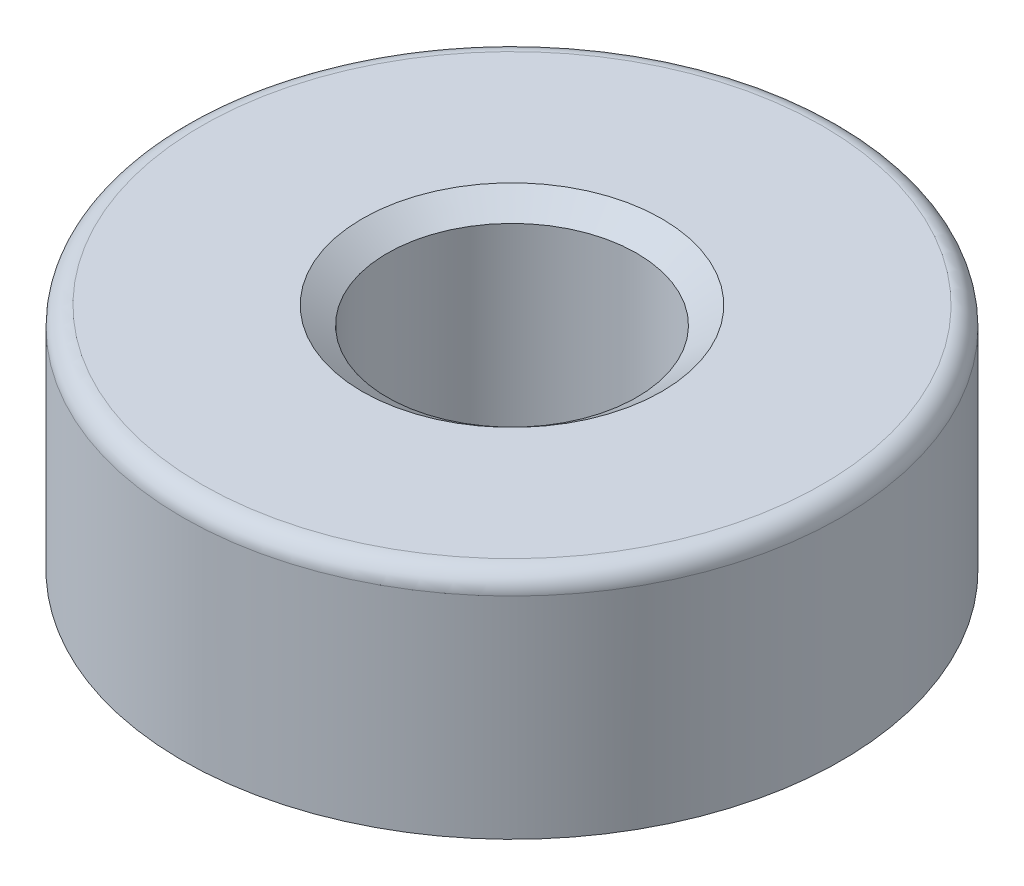
ISO-10303-21;
HEADER;
FILE_DESCRIPTION(('STEP AP214'),'2;1');
FILE_NAME('part.step','',(''),(''),'','','');
FILE_SCHEMA(('AUTOMOTIVE_DESIGN { 1 0 10303 214 1 1 1 1 }'));
ENDSEC;
DATA;
#1=APPLICATION_CONTEXT('core data for automotive mechanical design processes');
#2=APPLICATION_PROTOCOL_DEFINITION('international standard','automotive_design',2000,#1);
#3=PRODUCT_CONTEXT('',#1,'mechanical');
#4=PRODUCT('Part','Part','',(#3));
#5=PRODUCT_RELATED_PRODUCT_CATEGORY('part','',(#4));
#6=PRODUCT_DEFINITION_FORMATION('','',#4);
#7=PRODUCT_DEFINITION_CONTEXT('part definition',#1,'design');
#8=PRODUCT_DEFINITION('design','',#6,#7);
#9=PRODUCT_DEFINITION_SHAPE('','',#8);
#10=(LENGTH_UNIT() NAMED_UNIT(*) SI_UNIT(.MILLI.,.METRE.));
#11=(NAMED_UNIT(*) PLANE_ANGLE_UNIT() SI_UNIT($,.RADIAN.));
#12=(NAMED_UNIT(*) SI_UNIT($,.STERADIAN.) SOLID_ANGLE_UNIT());
#13=UNCERTAINTY_MEASURE_WITH_UNIT(LENGTH_MEASURE(1.E-05),#10,'distance_accuracy_value','');
#14=(GEOMETRIC_REPRESENTATION_CONTEXT(3) GLOBAL_UNCERTAINTY_ASSIGNED_CONTEXT((#13)) GLOBAL_UNIT_ASSIGNED_CONTEXT((#10,
#11,#12)) REPRESENTATION_CONTEXT('',''));
#15=CARTESIAN_POINT('',(0.,0.,0.));
#16=DIRECTION('',(0.,0.,1.));
#17=DIRECTION('',(1.,0.,0.));
#18=AXIS2_PLACEMENT_3D('',#15,#16,#17);
#19=CARTESIAN_POINT('',(0.,-0.62,0.));
#20=DIRECTION('',(0.,1.,0.));
#21=DIRECTION('',(0.,0.,1.));
#22=AXIS2_PLACEMENT_3D('',#19,#20,#21);
#23=CONICAL_SURFACE('',#22,5.739195,0.94660466981348);
#24=CARTESIAN_POINT('',(-4.06874801904767,-0.620199999999999,4.0472782921859));
#25=CARTESIAN_POINT('',(-4.14286310637155,-0.517112753494077,4.17564938903826));
#26=CARTESIAN_POINT('',(-4.2169246819247,-0.413872294418032,4.30392780078491));
#27=CARTESIAN_POINT('',(-4.36494079841771,-0.207084966593698,4.56029923488984));
#28=CARTESIAN_POINT('',(-4.43889533937358,-0.103538097891253,4.68839225727585));
#29=CARTESIAN_POINT('',(-4.51279636857473,0.000161983335473587,4.81639259458388));
#30=B_SPLINE_CURVE_WITH_KNOTS('',3,(#24,#25,#26,#27,#28,#29),.UNSPECIFIED.,.F.,.F.,(4,2,4),(0.,
0.54165629559253,1.08331251015165),.UNSPECIFIED.);
#31=CARTESIAN_POINT('',(-4.06889185849576,-0.62,4.04752742941811));
#32=VERTEX_POINT('',#31);
#33=CARTESIAN_POINT('',(-4.51268089852089,0.,4.81619259458389));
#34=VERTEX_POINT('',#33);
#35=EDGE_CURVE('E268',#32,#34,#30,.T.);
#36=ORIENTED_EDGE('',*,*,#35,.F.);
#37=CARTESIAN_POINT('',(0.,-0.62,0.));
#38=DIRECTION('',(0.,-1.,0.));
#39=DIRECTION('',(0.,0.,-1.));
#40=AXIS2_PLACEMENT_3D('',#37,#38,#39);
#41=CIRCLE('',#40,5.739195);
#42=CARTESIAN_POINT('',(-1.4708156471425,-0.620000000000001,5.54752742941806));
#43=VERTEX_POINT('',#42);
#44=EDGE_CURVE('E209',#43,#32,#41,.T.);
#45=ORIENTED_EDGE('',*,*,#44,.F.);
#46=CARTESIAN_POINT('',(-1.91472015722149,0.000161983335472199,6.31639259458383));
#47=CARTESIAN_POINT('',(-1.84081912802034,-0.103538097891254,6.1883922572758));
#48=CARTESIAN_POINT('',(-1.76686458706446,-0.207084966593699,6.06029923488979));
#49=CARTESIAN_POINT('',(-1.61884847057145,-0.413872294418032,5.80392780078486));
#50=CARTESIAN_POINT('',(-1.5447868950183,-0.517112753494077,5.67564938903821));
#51=CARTESIAN_POINT('',(-1.47067180769442,-0.6202,5.54727829218585));
#52=B_SPLINE_CURVE_WITH_KNOTS('',3,(#46,#47,#48,#49,#50,#51),.UNSPECIFIED.,.F.,.F.,(4,2,4),(0.,
0.541656214559123,1.08331251015165),.UNSPECIFIED.);
#53=CARTESIAN_POINT('',(-1.91460468716765,0.,6.31619259458383));
#54=VERTEX_POINT('',#53);
#55=EDGE_CURVE('E183',#54,#43,#52,.T.);
#56=ORIENTED_EDGE('',*,*,#55,.F.);
#57=CARTESIAN_POINT('',(0.,0.,0.));
#58=DIRECTION('',(0.,-1.,0.));
#59=DIRECTION('',(0.,0.,-1.));
#60=AXIS2_PLACEMENT_3D('',#57,#58,#59);
#61=CIRCLE('',#60,6.6);
#62=EDGE_CURVE('E140',#54,#34,#61,.T.);
#63=ORIENTED_EDGE('',*,*,#62,.T.);
#64=EDGE_LOOP('',(#36,#45,#56,#63));
#65=FACE_BOUND('',#64,.T.);
#66=ADVANCED_FACE('F33',(#65),#23,.T.);
#67=CARTESIAN_POINT('',(0.,0.,0.));
#68=DIRECTION('',(0.,-1.,0.));
#69=DIRECTION('',(0.,0.,-1.));
#70=AXIS2_PLACEMENT_3D('',#67,#68,#69);
#71=CONICAL_SURFACE('',#70,4.875805,0.948025993064503);
#72=CARTESIAN_POINT('',(-3.61859256893361,0.000157794868856668,3.26758618128429));
#73=CARTESIAN_POINT('',(-3.65622306168361,-0.0512666058775207,3.33276410664113));
#74=CARTESIAN_POINT('',(-3.69382633215927,-0.102770608864612,3.39789488163573));
#75=CARTESIAN_POINT('',(-3.76898426904814,-0.20591983781553,3.52807224691932));
#76=CARTESIAN_POINT('',(-3.80653893559592,-0.257565063387109,3.59311883744138));
#77=CARTESIAN_POINT('',(-3.88160569046957,-0.360979009329664,3.72313827084186));
#78=CARTESIAN_POINT('',(-3.91911777882197,-0.412747729623607,3.78811111376623));
#79=CARTESIAN_POINT('',(-3.99410416152295,-0.51639499406935,3.91799133848013));
#80=CARTESIAN_POINT('',(-4.03157845576648,-0.568273538525153,3.98289872008773));
#81=CARTESIAN_POINT('',(-4.06903612938159,-0.620200000000001,4.04777731392242));
#82=B_SPLINE_CURVE_WITH_KNOTS('',3,(#72,#73,#74,#75,#76,#77,#78,#79,#80,#81),.UNSPECIFIED.,.F.,
.F.,(4,2,2,2,4),(0.,0.273455849279699,0.546910939802342,0.820365859796347,1.09382153772949),.UNSPECIFIED.);
#83=CARTESIAN_POINT('',(-3.61870803898745,0.,3.26778618128429));
#84=VERTEX_POINT('',#83);
#85=EDGE_CURVE('E133',#84,#32,#82,.T.);
#86=ORIENTED_EDGE('',*,*,#85,.F.);
#87=CARTESIAN_POINT('',(0.,0.,0.));
#88=DIRECTION('',(0.,-1.,0.));
#89=DIRECTION('',(0.,0.,-1.));
#90=AXIS2_PLACEMENT_3D('',#87,#88,#89);
#91=CIRCLE('',#90,4.875805);
#92=CARTESIAN_POINT('',(-1.02063182763419,0.,4.76778618128425));
#93=VERTEX_POINT('',#92);
#94=EDGE_CURVE('E214',#93,#84,#91,.T.);
#95=ORIENTED_EDGE('',*,*,#94,.F.);
#96=CARTESIAN_POINT('',(-1.47095991802834,-0.6202,5.54777731392238));
#97=CARTESIAN_POINT('',(-1.43350224441323,-0.568273538525152,5.48289872008768));
#98=CARTESIAN_POINT('',(-1.39602795016969,-0.51639499406935,5.41799133848009));
#99=CARTESIAN_POINT('',(-1.32104156746871,-0.412747729623607,5.28811111376619));
#100=CARTESIAN_POINT('',(-1.28352947911631,-0.360979009329664,5.22313827084182));
#101=CARTESIAN_POINT('',(-1.20846272424266,-0.257565063387109,5.09311883744134));
#102=CARTESIAN_POINT('',(-1.17090805769488,-0.20591983781553,5.02807224691928));
#103=CARTESIAN_POINT('',(-1.09575012080601,-0.102770608864612,4.89789488163569));
#104=CARTESIAN_POINT('',(-1.05814685033034,-0.0512666058775214,4.83276410664109));
#105=CARTESIAN_POINT('',(-1.02051635758035,0.000157794868855518,4.76758618128425));
#106=B_SPLINE_CURVE_WITH_KNOTS('',3,(#96,#97,#98,#99,#100,#101,#102,#103,#104,#105),
.UNSPECIFIED.,.F.,.F.,(4,2,2,2,4),(0.,0.273455677933147,0.54691059792715,0.820365688449794,
1.09382153772949),.UNSPECIFIED.);
#107=EDGE_CURVE('E147',#43,#93,#106,.T.);
#108=ORIENTED_EDGE('',*,*,#107,.F.);
#109=ORIENTED_EDGE('',*,*,#44,.T.);
#110=EDGE_LOOP('',(#86,#95,#108,#109));
#111=FACE_BOUND('',#110,.T.);
#112=ADVANCED_FACE('F242',(#111),#71,.F.);
#113=CARTESIAN_POINT('',(-4.5127963685748,0.000161983335472237,-4.81639259458382));
#114=CARTESIAN_POINT('',(-4.43889533937364,-0.103538097891254,-4.68839225727579));
#115=CARTESIAN_POINT('',(-4.36494079841777,-0.2070849665937,-4.56029923488978));
#116=CARTESIAN_POINT('',(-4.21692468192476,-0.413872294418033,-4.30392780078485));
#117=CARTESIAN_POINT('',(-4.14286310637161,-0.517112753494078,-4.1756493890382));
#118=CARTESIAN_POINT('',(-4.06874801904773,-0.6202,-4.04727829218584));
#119=B_SPLINE_CURVE_WITH_KNOTS('',3,(#113,#114,#115,#116,#117,#118),.UNSPECIFIED.,.F.,.F.,(4,2,
4),(0.,0.541656214559123,1.08331251015165),.UNSPECIFIED.);
#120=CARTESIAN_POINT('',(-4.51268089852096,0.,-4.81619259458382));
#121=VERTEX_POINT('',#120);
#122=CARTESIAN_POINT('',(-4.06889185849581,-0.620000000000001,-4.04752742941805));
#123=VERTEX_POINT('',#122);
#124=EDGE_CURVE('E121',#121,#123,#119,.T.);
#125=ORIENTED_EDGE('',*,*,#124,.F.);
#126=CARTESIAN_POINT('',(-1.91460468716766,0.,-6.31619259458383));
#127=VERTEX_POINT('',#126);
#128=EDGE_CURVE('E130',#121,#127,#61,.T.);
#129=ORIENTED_EDGE('',*,*,#128,.T.);
#130=CARTESIAN_POINT('',(-1.47067180769442,-0.6202,-5.54727829218585));
#131=CARTESIAN_POINT('',(-1.5447868950183,-0.517112753494078,-5.67564938903821));
#132=CARTESIAN_POINT('',(-1.61884847057145,-0.413872294418033,-5.80392780078486));
#133=CARTESIAN_POINT('',(-1.76686458706446,-0.2070849665937,-6.06029923488979));
#134=CARTESIAN_POINT('',(-1.84081912802033,-0.103538097891254,-6.1883922572758));
#135=CARTESIAN_POINT('',(-1.91472015722149,0.000161983335472432,-6.31639259458383));
#136=B_SPLINE_CURVE_WITH_KNOTS('',3,(#130,#131,#132,#133,#134,#135),.UNSPECIFIED.,.F.,.F.,(4,2,
4),(0.,0.54165629559253,1.08331251015165),.UNSPECIFIED.);
#137=CARTESIAN_POINT('',(-1.4708156471425,-0.62,-5.54752742941806));
#138=VERTEX_POINT('',#137);
#139=EDGE_CURVE('E263',#138,#127,#136,.T.);
#140=ORIENTED_EDGE('',*,*,#139,.F.);
#141=EDGE_CURVE('E132',#123,#138,#41,.T.);
#142=ORIENTED_EDGE('',*,*,#141,.F.);
#143=EDGE_LOOP('',(#125,#129,#140,#142));
#144=FACE_BOUND('',#143,.T.);
#145=ADVANCED_FACE('F128',(#144),#23,.T.);
#146=CARTESIAN_POINT('',(-4.06903612938164,-0.6202,-4.04777731392236));
#147=CARTESIAN_POINT('',(-4.03157845576654,-0.568273538525153,-3.98289872008767));
#148=CARTESIAN_POINT('',(-3.994104161523,-0.516394994069351,-3.91799133848008));
#149=CARTESIAN_POINT('',(-3.91911777882202,-0.412747729623607,-3.78811111376618));
#150=CARTESIAN_POINT('',(-3.88160569046962,-0.360979009329664,-3.72313827084181));
#151=CARTESIAN_POINT('',(-3.80653893559597,-0.257565063387109,-3.59311883744133));
#152=CARTESIAN_POINT('',(-3.76898426904819,-0.20591983781553,-3.52807224691927));
#153=CARTESIAN_POINT('',(-3.69382633215931,-0.102770608864612,-3.39789488163568));
#154=CARTESIAN_POINT('',(-3.65622306168365,-0.0512666058775208,-3.33276410664108));
#155=CARTESIAN_POINT('',(-3.61859256893366,0.000157794868856417,-3.26758618128424));
#156=B_SPLINE_CURVE_WITH_KNOTS('',3,(#146,#147,#148,#149,#150,#151,#152,#153,#154,#155),
.UNSPECIFIED.,.F.,.F.,(4,2,2,2,4),(0.,0.273455677933146,0.546910597927151,0.820365688449794,
1.09382153772949),.UNSPECIFIED.);
#157=CARTESIAN_POINT('',(-3.6187080389875,0.,-3.26778618128424));
#158=VERTEX_POINT('',#157);
#159=EDGE_CURVE('E123',#123,#158,#156,.T.);
#160=ORIENTED_EDGE('',*,*,#159,.F.);
#161=ORIENTED_EDGE('',*,*,#141,.T.);
#162=CARTESIAN_POINT('',(-1.02051635758035,0.000157794868855449,-4.76758618128425));
#163=CARTESIAN_POINT('',(-1.05814685033034,-0.0512666058775218,-4.83276410664109));
#164=CARTESIAN_POINT('',(-1.09575012080601,-0.102770608864613,-4.89789488163569));
#165=CARTESIAN_POINT('',(-1.17090805769488,-0.20591983781553,-5.02807224691928));
#166=CARTESIAN_POINT('',(-1.20846272424266,-0.257565063387109,-5.09311883744134));
#167=CARTESIAN_POINT('',(-1.28352947911631,-0.360979009329664,-5.22313827084182));
#168=CARTESIAN_POINT('',(-1.32104156746871,-0.412747729623607,-5.28811111376619));
#169=CARTESIAN_POINT('',(-1.39602795016969,-0.51639499406935,-5.41799133848009));
#170=CARTESIAN_POINT('',(-1.43350224441323,-0.568273538525153,-5.48289872008768));
#171=CARTESIAN_POINT('',(-1.47095991802833,-0.6202,-5.54777731392238));
#172=B_SPLINE_CURVE_WITH_KNOTS('',3,(#162,#163,#164,#165,#166,#167,#168,#169,#170,#171),
.UNSPECIFIED.,.F.,.F.,(4,2,2,2,4),(0.,0.273455849279698,0.54691093980234,0.820365859796344,
1.09382153772949),.UNSPECIFIED.);
#173=CARTESIAN_POINT('',(-1.02063182763419,0.,-4.76778618128425));
#174=VERTEX_POINT('',#173);
#175=EDGE_CURVE('E12',#174,#138,#172,.T.);
#176=ORIENTED_EDGE('',*,*,#175,.F.);
#177=EDGE_CURVE('E217',#158,#174,#91,.T.);
#178=ORIENTED_EDGE('',*,*,#177,.F.);
#179=EDGE_LOOP('',(#160,#161,#176,#178));
#180=FACE_BOUND('',#179,.T.);
#181=ADVANCED_FACE('F248',(#180),#71,.F.);
#182=CARTESIAN_POINT('',(8.86925999725687,1.72516326526914,-1.5));
#183=CARTESIAN_POINT('',(8.61668385234593,1.5458008760868,-1.5));
#184=CARTESIAN_POINT('',(8.36401582950356,1.36656750104773,-1.5));
#185=CARTESIAN_POINT('',(7.85841621487296,1.00847231791438,-1.5));
#186=CARTESIAN_POINT('',(7.60548462277595,0.829610510256112,-1.5));
#187=CARTESIAN_POINT('',(7.09930673456451,0.472392242511235,-1.5));
#188=CARTESIAN_POINT('',(6.84606047648615,0.294035728550428,-1.5));
#189=CARTESIAN_POINT('',(6.33909502258714,-0.062010973791701,-1.5));
#190=CARTESIAN_POINT('',(6.08537582104095,-0.239701154026799,-1.5));
#191=CARTESIAN_POINT('',(5.57723463174728,-0.594154416323298,-1.5));
#192=CARTESIAN_POINT('',(5.32281254582899,-0.770917357725343,-1.5));
#193=CARTESIAN_POINT('',(4.81299674413278,-1.12302452617424,-1.5));
#194=CARTESIAN_POINT('',(4.55760305649582,-1.29836879385777,-1.5));
#195=CARTESIAN_POINT('',(4.17333837904749,-1.55969750202553,-1.5));
#196=CARTESIAN_POINT('',(4.04504565377055,-1.64653166628858,-1.5));
#197=CARTESIAN_POINT('',(3.78795873056902,-1.81945143648549,-1.5));
#198=CARTESIAN_POINT('',(3.65916453893301,-1.90553705176293,-1.5));
#199=CARTESIAN_POINT('',(3.40091251838098,-2.07673760274608,-1.5));
#200=CARTESIAN_POINT('',(3.27145462585688,-2.16185244279453,-1.5));
#201=CARTESIAN_POINT('',(3.01163528763851,-2.33070257150585,-1.5));
#202=CARTESIAN_POINT('',(2.88127380297785,-2.41443780014204,-1.5));
#203=CARTESIAN_POINT('',(2.75033992223718,-2.49727934429453,-1.5));
#204=B_SPLINE_CURVE_WITH_KNOTS('',3,(#182,#183,#184,#185,#186,#187,#188,#189,#190,#191,#192,
#193,#194,#195,#196,#197,#198,#199,#200,#201,#202,#203),.UNSPECIFIED.,.F.,.F.,(4,2,2,2,2,2,2,2,
2,2,4),(0.,0.929349615867427,1.85870032168396,2.78794790076043,3.71720680350201,
4.64660281604826,5.57597211192494,6.04072029179811,6.50546266220564,6.9702504380135,
7.43505838354279),.UNSPECIFIED.);
#205=CARTESIAN_POINT('',(6.42728558568857,0.,-1.5));
#206=VERTEX_POINT('',#205);
#207=CARTESIAN_POINT('',(5.53970750563827,-0.62,-1.5));
#208=VERTEX_POINT('',#207);
#209=EDGE_CURVE('E259',#206,#208,#204,.T.);
#210=ORIENTED_EDGE('',*,*,#209,.F.);
#211=CARTESIAN_POINT('',(6.42728558568857,0.,1.5));
#212=VERTEX_POINT('',#211);
#213=EDGE_CURVE('E141',#206,#212,#61,.T.);
#214=ORIENTED_EDGE('',*,*,#213,.T.);
#215=CARTESIAN_POINT('',(2.75033992223718,-2.49727934429453,1.5));
#216=CARTESIAN_POINT('',(2.88127380297786,-2.41443780014204,1.5));
#217=CARTESIAN_POINT('',(3.01163528763851,-2.33070257150585,1.5));
#218=CARTESIAN_POINT('',(3.27145462585688,-2.16185244279453,1.5));
#219=CARTESIAN_POINT('',(3.40091251838098,-2.07673760274608,1.5));
#220=CARTESIAN_POINT('',(3.65916453893301,-1.90553705176293,1.5));
#221=CARTESIAN_POINT('',(3.78795873056903,-1.81945143648549,1.5));
#222=CARTESIAN_POINT('',(4.04504565377055,-1.64653166628858,1.5));
#223=CARTESIAN_POINT('',(4.17333837904749,-1.55969750202553,1.5));
#224=CARTESIAN_POINT('',(4.55760305649582,-1.29836879385777,1.5));
#225=CARTESIAN_POINT('',(4.81299674413278,-1.12302452617424,1.5));
#226=CARTESIAN_POINT('',(5.322812545829,-0.770917357725342,1.5));
#227=CARTESIAN_POINT('',(5.57723463174728,-0.594154416323297,1.5));
#228=CARTESIAN_POINT('',(6.08537582104095,-0.239701154026798,1.5));
#229=CARTESIAN_POINT('',(6.33909502258714,-0.0620109737916993,1.5));
#230=CARTESIAN_POINT('',(6.84606047648615,0.29403572855043,1.5));
#231=CARTESIAN_POINT('',(7.09930673456451,0.472392242511237,1.5));
#232=CARTESIAN_POINT('',(7.60548462277596,0.829610510256114,1.5));
#233=CARTESIAN_POINT('',(7.85841621487296,1.00847231791438,1.5));
#234=CARTESIAN_POINT('',(8.36401582950356,1.36656750104774,1.5));
#235=CARTESIAN_POINT('',(8.61668385234592,1.5458008760868,1.5));
#236=CARTESIAN_POINT('',(8.86925999725687,1.72516326526914,1.5));
#237=B_SPLINE_CURVE_WITH_KNOTS('',3,(#215,#216,#217,#218,#219,#220,#221,#222,#223,#224,#225,
#226,#227,#228,#229,#230,#231,#232,#233,#234,#235,#236),.UNSPECIFIED.,.F.,.F.,(4,2,2,2,2,2,2,2,
2,2,4),(0.,0.464807945529292,0.929595721337157,1.39433809174468,1.85908627161785,
2.78845556749453,3.71785158004079,4.64711048278237,5.57635806185883,6.50570876767537,
7.43505838354279),.UNSPECIFIED.);
#238=CARTESIAN_POINT('',(5.53970750563827,-0.62,1.5));
#239=VERTEX_POINT('',#238);
#240=EDGE_CURVE('E189',#239,#212,#237,.T.);
#241=ORIENTED_EDGE('',*,*,#240,.F.);
#242=EDGE_CURVE('E213',#208,#239,#41,.T.);
#243=ORIENTED_EDGE('',*,*,#242,.F.);
#244=EDGE_LOOP('',(#210,#214,#241,#243));
#245=FACE_BOUND('',#244,.T.);
#246=ADVANCED_FACE('F35',(#245),#23,.T.);
#247=CARTESIAN_POINT('',(0.,0.,0.));
#248=DIRECTION('',(0.,-1.,0.));
#249=DIRECTION('',(0.,0.,-1.));
#250=AXIS2_PLACEMENT_3D('',#247,#248,#249);
#251=CYLINDRICAL_SURFACE('',#250,6.6);
#252=CARTESIAN_POINT('',(0.,4.219,0.));
#253=DIRECTION('',(0.,-1.,0.));
#254=DIRECTION('',(0.,0.,-1.));
#255=AXIS2_PLACEMENT_3D('',#252,#253,#254);
#256=CIRCLE('',#255,6.6);
#257=CARTESIAN_POINT('',(0.,4.219,-6.6));
#258=VERTEX_POINT('',#257);
#259=EDGE_CURVE('E144',#258,#258,#256,.T.);
#260=ORIENTED_EDGE('',*,*,#259,.T.);
#261=EDGE_LOOP('',(#260));
#262=FACE_BOUND('',#261,.T.);
#263=EDGE_CURVE('E143',#212,#54,#61,.T.);
#264=ORIENTED_EDGE('',*,*,#263,.F.);
#265=ORIENTED_EDGE('',*,*,#213,.F.);
#266=CARTESIAN_POINT('',(0.,0.,0.));
#267=DIRECTION('',(0.,1.,0.));
#268=DIRECTION('',(0.866025403784436,0.,-0.500000000000004));
#269=AXIS2_PLACEMENT_3D('',#266,#267,#268);
#270=CIRCLE('',#269,6.6);
#271=EDGE_CURVE('E139',#206,#127,#270,.T.);
#272=ORIENTED_EDGE('',*,*,#271,.T.);
#273=ORIENTED_EDGE('',*,*,#128,.F.);
#274=CARTESIAN_POINT('',(0.,0.,0.));
#275=DIRECTION('',(0.,1.,0.));
#276=DIRECTION('',(-0.866025403784443,0.,-0.499999999999992));
#277=AXIS2_PLACEMENT_3D('',#274,#275,#276);
#278=CIRCLE('',#277,6.6);
#279=EDGE_CURVE('E108',#121,#34,#278,.T.);
#280=ORIENTED_EDGE('',*,*,#279,.T.);
#281=ORIENTED_EDGE('',*,*,#62,.F.);
#282=EDGE_LOOP('',(#264,#265,#272,#273,#280,#281));
#283=FACE_BOUND('',#282,.T.);
#284=ADVANCED_FACE('F137',(#262,#283),#251,.T.);
#285=CARTESIAN_POINT('',(0.,4.219,0.));
#286=DIRECTION('',(0.,-1.,0.));
#287=DIRECTION('',(0.,0.,-1.));
#288=AXIS2_PLACEMENT_3D('',#285,#286,#287);
#289=TOROIDAL_SURFACE('',#288,6.219,0.381000000000001);
#290=CARTESIAN_POINT('',(0.,4.6,0.));
#291=DIRECTION('',(0.,-1.,0.));
#292=DIRECTION('',(0.,0.,-1.));
#293=AXIS2_PLACEMENT_3D('',#290,#291,#292);
#294=CIRCLE('',#293,6.219);
#295=CARTESIAN_POINT('',(0.,4.6,-6.219));
#296=VERTEX_POINT('',#295);
#297=EDGE_CURVE('E223',#296,#296,#294,.T.);
#298=ORIENTED_EDGE('',*,*,#297,.T.);
#299=EDGE_LOOP('',(#298));
#300=FACE_BOUND('',#299,.T.);
#301=ORIENTED_EDGE('',*,*,#259,.F.);
#302=EDGE_LOOP('',(#301));
#303=FACE_BOUND('',#302,.T.);
#304=ADVANCED_FACE('F229',(#300,#303),#289,.T.);
#305=CARTESIAN_POINT('',(6.219,4.6,0.));
#306=DIRECTION('',(0.,1.,0.));
#307=DIRECTION('',(0.,0.,1.));
#308=AXIS2_PLACEMENT_3D('',#305,#306,#307);
#309=PLANE('',#308);
#310=CARTESIAN_POINT('',(0.,4.6,0.));
#311=DIRECTION('',(0.,-1.,0.));
#312=DIRECTION('',(0.,0.,-1.));
#313=AXIS2_PLACEMENT_3D('',#310,#311,#312);
#314=CIRCLE('',#313,3.);
#315=CARTESIAN_POINT('',(0.,4.6,-3.));
#316=VERTEX_POINT('',#315);
#317=EDGE_CURVE('E200',#316,#316,#314,.T.);
#318=ORIENTED_EDGE('',*,*,#317,.T.);
#319=EDGE_LOOP('',(#318));
#320=FACE_BOUND('',#319,.T.);
#321=ORIENTED_EDGE('',*,*,#297,.F.);
#322=EDGE_LOOP('',(#321));
#323=FACE_BOUND('',#322,.T.);
#324=ADVANCED_FACE('F231',(#320,#323),#309,.T.);
#325=CARTESIAN_POINT('',(0.,0.,0.));
#326=DIRECTION('',(0.,-1.,0.));
#327=DIRECTION('',(0.,0.,-1.));
#328=AXIS2_PLACEMENT_3D('',#325,#326,#327);
#329=CYLINDRICAL_SURFACE('',#328,2.5);
#330=CARTESIAN_POINT('',(0.,4.25002626739341,0.));
#331=DIRECTION('',(0.,-1.,0.));
#332=DIRECTION('',(0.,0.,-1.));
#333=AXIS2_PLACEMENT_3D('',#330,#331,#332);
#334=CIRCLE('',#333,2.5);
#335=CARTESIAN_POINT('',(0.,4.25002626739341,-2.5));
#336=VERTEX_POINT('',#335);
#337=EDGE_CURVE('E197',#336,#336,#334,.T.);
#338=ORIENTED_EDGE('',*,*,#337,.F.);
#339=EDGE_LOOP('',(#338));
#340=FACE_BOUND('',#339,.T.);
#341=CARTESIAN_POINT('',(0.,-0.636026267393412,0.));
#342=DIRECTION('',(0.,-1.,0.));
#343=DIRECTION('',(0.,0.,-1.));
#344=AXIS2_PLACEMENT_3D('',#341,#342,#343);
#345=CIRCLE('',#344,2.5);
#346=CARTESIAN_POINT('',(0.,-0.636026267393412,-2.5));
#347=VERTEX_POINT('',#346);
#348=EDGE_CURVE('E206',#347,#347,#345,.T.);
#349=ORIENTED_EDGE('',*,*,#348,.T.);
#350=EDGE_LOOP('',(#349));
#351=FACE_BOUND('',#350,.T.);
#352=ADVANCED_FACE('F238',(#340,#351),#329,.F.);
#353=CARTESIAN_POINT('',(2.5,-1.24,0.));
#354=DIRECTION('',(0.,-1.,0.));
#355=DIRECTION('',(0.,0.,-1.));
#356=AXIS2_PLACEMENT_3D('',#353,#354,#355);
#357=PLANE('',#356);
#358=CARTESIAN_POINT('',(0.,-1.24,0.));
#359=DIRECTION('',(0.,-1.,0.));
#360=DIRECTION('',(0.,0.,-1.));
#361=AXIS2_PLACEMENT_3D('',#358,#359,#360);
#362=CIRCLE('',#361,3.);
#363=CARTESIAN_POINT('',(0.,-1.24,-3.));
#364=VERTEX_POINT('',#363);
#365=EDGE_CURVE('E162',#364,#364,#362,.T.);
#366=ORIENTED_EDGE('',*,*,#365,.F.);
#367=EDGE_LOOP('',(#366));
#368=FACE_BOUND('',#367,.T.);
#369=CARTESIAN_POINT('',(0.,-1.24,0.));
#370=DIRECTION('',(0.,-1.,0.));
#371=DIRECTION('',(0.,0.,-1.));
#372=AXIS2_PLACEMENT_3D('',#369,#370,#371);
#373=CIRCLE('',#372,4.015);
#374=CARTESIAN_POINT('',(0.,-1.24,-4.015));
#375=VERTEX_POINT('',#374);
#376=EDGE_CURVE('E220',#375,#375,#373,.T.);
#377=ORIENTED_EDGE('',*,*,#376,.T.);
#378=EDGE_LOOP('',(#377));
#379=FACE_BOUND('',#378,.T.);
#380=ADVANCED_FACE('F307',(#368,#379),#357,.T.);
#381=CARTESIAN_POINT('',(0.,0.,0.));
#382=DIRECTION('',(0.,-1.,0.));
#383=DIRECTION('',(0.,0.,-1.));
#384=AXIS2_PLACEMENT_3D('',#381,#382,#383);
#385=CYLINDRICAL_SURFACE('',#384,4.015);
#386=CARTESIAN_POINT('',(0.,0.,0.));
#387=DIRECTION('',(0.,-1.,0.));
#388=DIRECTION('',(0.,0.,-1.));
#389=AXIS2_PLACEMENT_3D('',#386,#387,#388);
#390=CIRCLE('',#389,4.015);
#391=CARTESIAN_POINT('',(0.,0.,-4.015));
#392=VERTEX_POINT('',#391);
#393=EDGE_CURVE('E216',#392,#392,#390,.T.);
#394=ORIENTED_EDGE('',*,*,#393,.T.);
#395=EDGE_LOOP('',(#394));
#396=FACE_BOUND('',#395,.T.);
#397=ORIENTED_EDGE('',*,*,#376,.F.);
#398=EDGE_LOOP('',(#397));
#399=FACE_BOUND('',#398,.T.);
#400=ADVANCED_FACE('F310',(#396,#399),#385,.T.);
#401=CARTESIAN_POINT('',(4.015,0.,0.));
#402=DIRECTION('',(0.,-1.,0.));
#403=DIRECTION('',(0.,0.,-1.));
#404=AXIS2_PLACEMENT_3D('',#401,#402,#403);
#405=PLANE('',#404);
#406=ORIENTED_EDGE('',*,*,#94,.T.);
#407=DIRECTION('',(0.499999999999992,0.,-0.866025403784443));
#408=VECTOR('',#407,1.);
#409=CARTESIAN_POINT('',(-3.61870803898745,0.,3.26778618128429));
#410=LINE('',#409,#408);
#411=EDGE_CURVE('E112',#34,#84,#410,.T.);
#412=ORIENTED_EDGE('',*,*,#411,.F.);
#413=ORIENTED_EDGE('',*,*,#279,.F.);
#414=DIRECTION('',(-0.500000000000004,0.,-0.866025403784437));
#415=VECTOR('',#414,1.);
#416=CARTESIAN_POINT('',(-3.6187080389875,0.,-3.26778618128424));
#417=LINE('',#416,#415);
#418=EDGE_CURVE('E54',#158,#121,#417,.T.);
#419=ORIENTED_EDGE('',*,*,#418,.F.);
#420=ORIENTED_EDGE('',*,*,#177,.T.);
#421=DIRECTION('',(0.500000000000004,0.,0.866025403784436));
#422=VECTOR('',#421,1.);
#423=CARTESIAN_POINT('',(-1.02063182763419,0.,-4.76778618128425));
#424=LINE('',#423,#422);
#425=EDGE_CURVE('E264',#127,#174,#424,.T.);
#426=ORIENTED_EDGE('',*,*,#425,.F.);
#427=ORIENTED_EDGE('',*,*,#271,.F.);
#428=DIRECTION('',(1.,0.,0.));
#429=VECTOR('',#428,1.);
#430=CARTESIAN_POINT('',(4.63933986662165,0.,-1.5));
#431=LINE('',#430,#429);
#432=CARTESIAN_POINT('',(4.63933986662165,0.,-1.5));
#433=VERTEX_POINT('',#432);
#434=EDGE_CURVE('E61',#433,#206,#431,.T.);
#435=ORIENTED_EDGE('',*,*,#434,.F.);
#436=CARTESIAN_POINT('',(4.63933986662165,0.,1.5));
#437=VERTEX_POINT('',#436);
#438=EDGE_CURVE('E212',#433,#437,#91,.T.);
#439=ORIENTED_EDGE('',*,*,#438,.T.);
#440=DIRECTION('',(-1.,0.,0.));
#441=VECTOR('',#440,1.);
#442=CARTESIAN_POINT('',(4.63933986662165,0.,1.5));
#443=LINE('',#442,#441);
#444=EDGE_CURVE('E190',#212,#437,#443,.T.);
#445=ORIENTED_EDGE('',*,*,#444,.F.);
#446=ORIENTED_EDGE('',*,*,#263,.T.);
#447=DIRECTION('',(-0.500000000000004,0.,0.866025403784436));
#448=VECTOR('',#447,1.);
#449=CARTESIAN_POINT('',(-1.02063182763419,0.,4.76778618128425));
#450=LINE('',#449,#448);
#451=EDGE_CURVE('E269',#93,#54,#450,.T.);
#452=ORIENTED_EDGE('',*,*,#451,.F.);
#453=EDGE_LOOP('',(#406,#412,#413,#419,#420,#426,#427,#435,#439,#445,#446,#452));
#454=FACE_BOUND('',#453,.T.);
#455=ORIENTED_EDGE('',*,*,#393,.F.);
#456=EDGE_LOOP('',(#455));
#457=FACE_BOUND('',#456,.T.);
#458=ADVANCED_FACE('F110',(#454,#457),#405,.T.);
#459=CARTESIAN_POINT('',(7.17434300509643,-1.76197910201567,-1.5));
#460=CARTESIAN_POINT('',(7.00499711306049,-1.6429508289911,-1.5));
#461=CARTESIAN_POINT('',(6.83557260864765,-1.52403413479858,-1.5));
#462=CARTESIAN_POINT('',(6.49651646256988,-1.28649472026761,-1.5));
#463=CARTESIAN_POINT('',(6.32688481991497,-1.16787200134244,-1.5));
#464=CARTESIAN_POINT('',(5.98737876767778,-0.931001328991675,-1.5));
#465=CARTESIAN_POINT('',(5.81750437714141,-0.812753348280076,-1.5));
#466=CARTESIAN_POINT('',(5.47742902610203,-0.576728402004284,-1.5));
#467=CARTESIAN_POINT('',(5.30722806622012,-0.458951435545578,-1.5));
#468=CARTESIAN_POINT('',(4.96638649083923,-0.224004721927326,-1.5));
#469=CARTESIAN_POINT('',(4.7957458402329,-0.106835025656142,-1.5));
#470=CARTESIAN_POINT('',(4.45389807063367,0.126671485531359,-1.5));
#471=CARTESIAN_POINT('',(4.28269095816121,0.243008309986299,-1.5));
#472=CARTESIAN_POINT('',(3.93948394748186,0.47453815244329,-1.5));
#473=CARTESIAN_POINT('',(3.7674839891679,0.589731081564755,-1.5));
#474=CARTESIAN_POINT('',(3.50864764846166,0.761266290299703,-1.5));
#475=CARTESIAN_POINT('',(3.42222779854275,0.818236745380781,-1.5));
#476=CARTESIAN_POINT('',(3.2490451143792,0.931655959309995,-1.5));
#477=CARTESIAN_POINT('',(3.16228227608233,0.988104711968027,-1.5));
#478=CARTESIAN_POINT('',(3.07531633276036,1.04424050164747,-1.5));
#479=B_SPLINE_CURVE_WITH_KNOTS('',3,(#459,#460,#461,#462,#463,#464,#465,#466,#467,#468,#469,
#470,#471,#472,#473,#474,#475,#476,#477,#478),.UNSPECIFIED.,.F.,.F.,(4,2,2,2,2,2,2,2,2,4),(0.,
0.620976711581279,1.24195640273433,1.86288978853443,2.48382199454568,3.10480541869554,
3.72578171950115,4.34680589841148,4.65732992547155,4.96785763224405),.UNSPECIFIED.);
#480=EDGE_CURVE('E47',#208,#433,#479,.T.);
#481=ORIENTED_EDGE('',*,*,#480,.F.);
#482=ORIENTED_EDGE('',*,*,#242,.T.);
#483=CARTESIAN_POINT('',(3.07531633276036,1.04424050164747,1.5));
#484=CARTESIAN_POINT('',(3.16228227608233,0.988104711968028,1.5));
#485=CARTESIAN_POINT('',(3.2490451143792,0.931655959309995,1.5));
#486=CARTESIAN_POINT('',(3.42222779854275,0.818236745380781,1.5));
#487=CARTESIAN_POINT('',(3.50864764846166,0.761266290299704,1.5));
#488=CARTESIAN_POINT('',(3.7674839891679,0.589731081564755,1.5));
#489=CARTESIAN_POINT('',(3.93948394748186,0.474538152443291,1.5));
#490=CARTESIAN_POINT('',(4.28269095816121,0.243008309986298,1.5));
#491=CARTESIAN_POINT('',(4.45389807063367,0.126671485531357,1.5));
#492=CARTESIAN_POINT('',(4.79574584023291,-0.10683502565614,1.5));
#493=CARTESIAN_POINT('',(4.96638649083923,-0.224004721927318,1.5));
#494=CARTESIAN_POINT('',(5.30722806622012,-0.458951435545571,1.5));
#495=CARTESIAN_POINT('',(5.47742902610203,-0.576728402004283,1.5));
#496=CARTESIAN_POINT('',(5.81750437714141,-0.812753348280079,1.5));
#497=CARTESIAN_POINT('',(5.98737876767778,-0.931001328991676,1.5));
#498=CARTESIAN_POINT('',(6.32688481991498,-1.16787200134244,1.5));
#499=CARTESIAN_POINT('',(6.49651646256988,-1.28649472026761,1.5));
#500=CARTESIAN_POINT('',(6.83557260864765,-1.52403413479858,1.5));
#501=CARTESIAN_POINT('',(7.00499711306049,-1.6429508289911,1.5));
#502=CARTESIAN_POINT('',(7.17434300509643,-1.76197910201567,1.5));
#503=B_SPLINE_CURVE_WITH_KNOTS('',3,(#483,#484,#485,#486,#487,#488,#489,#490,#491,#492,#493,
#494,#495,#496,#497,#498,#499,#500,#501,#502),.UNSPECIFIED.,.F.,.F.,(4,2,2,2,2,2,2,2,2,4),(0.,
0.310527706772496,0.621051733832573,1.2420759127429,1.86305221354851,2.48403563769837,
3.10496784370962,3.72590122950972,4.34688092066277,4.96785763224405),.UNSPECIFIED.);
#504=EDGE_CURVE('E151',#437,#239,#503,.T.);
#505=ORIENTED_EDGE('',*,*,#504,.F.);
#506=ORIENTED_EDGE('',*,*,#438,.F.);
#507=EDGE_LOOP('',(#481,#482,#505,#506));
#508=FACE_BOUND('',#507,.T.);
#509=ADVANCED_FACE('F167',(#508),#71,.F.);
#510=CARTESIAN_POINT('',(0.,-0.986,0.));
#511=DIRECTION('',(0.,-1.,0.));
#512=DIRECTION('',(0.,0.,-1.));
#513=AXIS2_PLACEMENT_3D('',#510,#511,#512);
#514=CONICAL_SURFACE('',#513,3.,0.960105621522086);
#515=ORIENTED_EDGE('',*,*,#348,.F.);
#516=EDGE_LOOP('',(#515));
#517=FACE_BOUND('',#516,.T.);
#518=CARTESIAN_POINT('',(0.,-0.986,0.));
#519=DIRECTION('',(0.,-1.,0.));
#520=DIRECTION('',(0.,0.,-1.));
#521=AXIS2_PLACEMENT_3D('',#518,#519,#520);
#522=CIRCLE('',#521,3.);
#523=CARTESIAN_POINT('',(0.,-0.986,-3.));
#524=VERTEX_POINT('',#523);
#525=EDGE_CURVE('E203',#524,#524,#522,.T.);
#526=ORIENTED_EDGE('',*,*,#525,.T.);
#527=EDGE_LOOP('',(#526));
#528=FACE_BOUND('',#527,.T.);
#529=ADVANCED_FACE('F329',(#517,#528),#514,.F.);
#530=CARTESIAN_POINT('',(0.,-2.54,0.));
#531=DIRECTION('',(0.,-1.,0.));
#532=DIRECTION('',(0.,0.,-1.));
#533=AXIS2_PLACEMENT_3D('',#530,#531,#532);
#534=CYLINDRICAL_SURFACE('',#533,3.);
#535=ORIENTED_EDGE('',*,*,#365,.T.);
#536=EDGE_LOOP('',(#535));
#537=FACE_BOUND('',#536,.T.);
#538=ORIENTED_EDGE('',*,*,#525,.F.);
#539=EDGE_LOOP('',(#538));
#540=FACE_BOUND('',#539,.T.);
#541=ADVANCED_FACE('F304',(#537,#540),#534,.F.);
#542=CARTESIAN_POINT('',(0.,4.25002626739341,0.));
#543=DIRECTION('',(0.,1.,0.));
#544=DIRECTION('',(0.,0.,1.));
#545=AXIS2_PLACEMENT_3D('',#542,#543,#544);
#546=CONICAL_SURFACE('',#545,2.5,0.960105621522089);
#547=ORIENTED_EDGE('',*,*,#317,.F.);
#548=EDGE_LOOP('',(#547));
#549=FACE_BOUND('',#548,.T.);
#550=ORIENTED_EDGE('',*,*,#337,.T.);
#551=EDGE_LOOP('',(#550));
#552=FACE_BOUND('',#551,.T.);
#553=ADVANCED_FACE('F179',(#549,#552),#546,.F.);
#554=CARTESIAN_POINT('',(4.63933986662165,-6.35,1.5));
#555=DIRECTION('',(0.,0.,-1.));
#556=DIRECTION('',(-1.,0.,0.));
#557=AXIS2_PLACEMENT_3D('',#554,#555,#556);
#558=PLANE('',#557);
#559=ORIENTED_EDGE('',*,*,#240,.T.);
#560=ORIENTED_EDGE('',*,*,#444,.T.);
#561=ORIENTED_EDGE('',*,*,#504,.T.);
#562=EDGE_LOOP('',(#559,#560,#561));
#563=FACE_BOUND('',#562,.T.);
#564=ADVANCED_FACE('F176',(#563),#558,.F.);
#565=CARTESIAN_POINT('',(-1.02063182763419,-6.35,4.76778618128425));
#566=DIRECTION('',(-0.866025403784436,0.,-0.500000000000004));
#567=DIRECTION('',(-0.500000000000004,0.,0.866025403784436));
#568=AXIS2_PLACEMENT_3D('',#565,#566,#567);
#569=PLANE('',#568);
#570=ORIENTED_EDGE('',*,*,#55,.T.);
#571=ORIENTED_EDGE('',*,*,#107,.T.);
#572=ORIENTED_EDGE('',*,*,#451,.T.);
#573=EDGE_LOOP('',(#570,#571,#572));
#574=FACE_BOUND('',#573,.T.);
#575=ADVANCED_FACE('F171',(#574),#569,.F.);
#576=CARTESIAN_POINT('',(-1.02063182763419,-6.35,-4.76778618128425));
#577=DIRECTION('',(-0.866025403784436,0.,0.500000000000004));
#578=DIRECTION('',(0.500000000000004,0.,0.866025403784436));
#579=AXIS2_PLACEMENT_3D('',#576,#577,#578);
#580=PLANE('',#579);
#581=ORIENTED_EDGE('',*,*,#139,.T.);
#582=ORIENTED_EDGE('',*,*,#425,.T.);
#583=ORIENTED_EDGE('',*,*,#175,.T.);
#584=EDGE_LOOP('',(#581,#582,#583));
#585=FACE_BOUND('',#584,.T.);
#586=ADVANCED_FACE('F175',(#585),#580,.F.);
#587=CARTESIAN_POINT('',(4.63933986662165,-6.35,-1.5));
#588=DIRECTION('',(0.,0.,1.));
#589=DIRECTION('',(1.,0.,0.));
#590=AXIS2_PLACEMENT_3D('',#587,#588,#589);
#591=PLANE('',#590);
#592=ORIENTED_EDGE('',*,*,#209,.T.);
#593=ORIENTED_EDGE('',*,*,#480,.T.);
#594=ORIENTED_EDGE('',*,*,#434,.T.);
#595=EDGE_LOOP('',(#592,#593,#594));
#596=FACE_BOUND('',#595,.T.);
#597=ADVANCED_FACE('F283',(#596),#591,.F.);
#598=CARTESIAN_POINT('',(-3.61870803898745,-6.35,3.26778618128429));
#599=DIRECTION('',(0.866025403784443,0.,0.499999999999992));
#600=DIRECTION('',(0.499999999999992,0.,-0.866025403784443));
#601=AXIS2_PLACEMENT_3D('',#598,#599,#600);
#602=PLANE('',#601);
#603=ORIENTED_EDGE('',*,*,#35,.T.);
#604=ORIENTED_EDGE('',*,*,#411,.T.);
#605=ORIENTED_EDGE('',*,*,#85,.T.);
#606=EDGE_LOOP('',(#603,#604,#605));
#607=FACE_BOUND('',#606,.T.);
#608=ADVANCED_FACE('F290',(#607),#602,.F.);
#609=CARTESIAN_POINT('',(-3.6187080389875,-6.35,-3.26778618128424));
#610=DIRECTION('',(0.866025403784436,0.,-0.500000000000004));
#611=DIRECTION('',(-0.500000000000004,0.,-0.866025403784437));
#612=AXIS2_PLACEMENT_3D('',#609,#610,#611);
#613=PLANE('',#612);
#614=ORIENTED_EDGE('',*,*,#124,.T.);
#615=ORIENTED_EDGE('',*,*,#159,.T.);
#616=ORIENTED_EDGE('',*,*,#418,.T.);
#617=EDGE_LOOP('',(#614,#615,#616));
#618=FACE_BOUND('',#617,.T.);
#619=ADVANCED_FACE('F120',(#618),#613,.F.);
#620=CLOSED_SHELL('',(#66,#112,#145,#181,#246,#284,#304,#324,#352,#380,#400,#458,#509,#529,#541,
#553,#564,#575,#586,#597,#608,#619));
#621=MANIFOLD_SOLID_BREP('B2',#620);
#622=ADVANCED_BREP_SHAPE_REPRESENTATION('',(#18,#621),#14);
#623=SHAPE_DEFINITION_REPRESENTATION(#9,#622);
ENDSEC;
END-ISO-10303-21;
